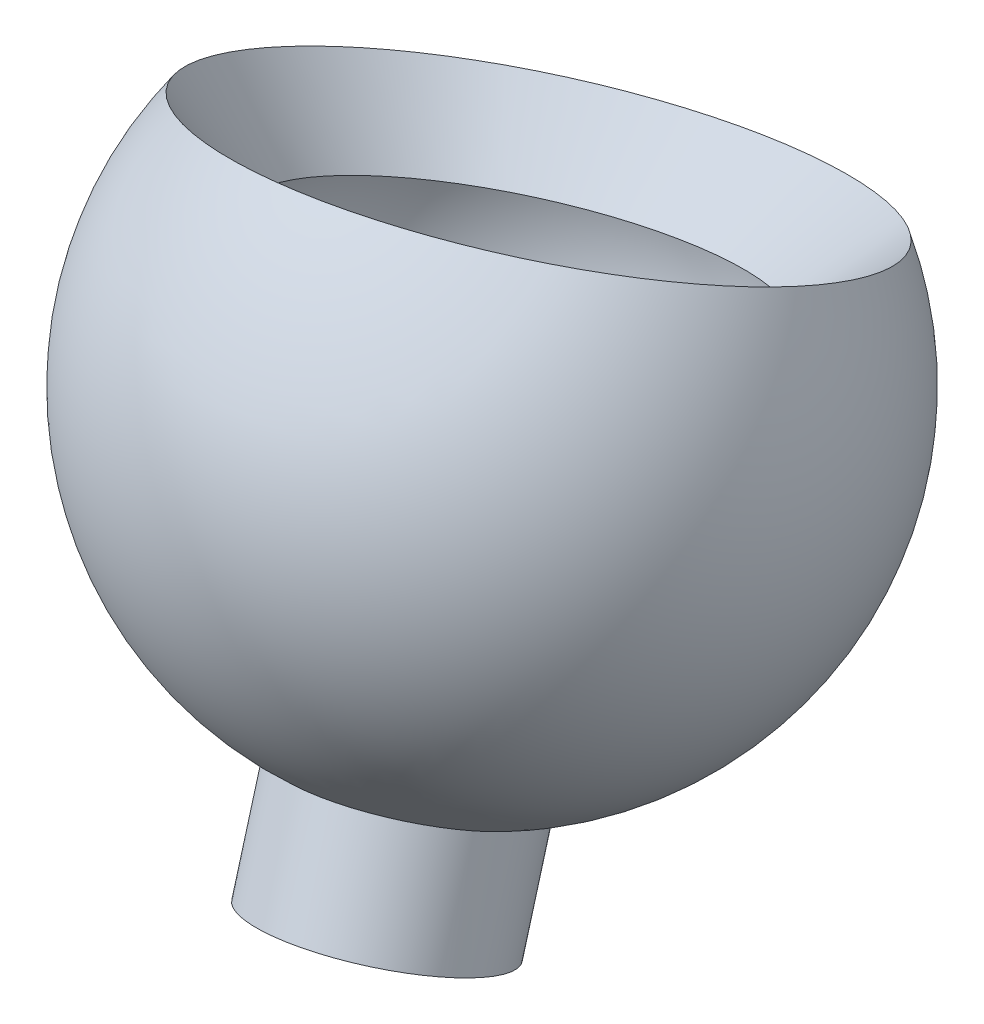
ISO-10303-21;
HEADER;
FILE_DESCRIPTION(('STEP AP214'),'2;1');
FILE_NAME('part.step','',(''),(''),'','','');
FILE_SCHEMA(('AUTOMOTIVE_DESIGN { 1 0 10303 214 1 1 1 1 }'));
ENDSEC;
DATA;
#1=APPLICATION_CONTEXT('core data for automotive mechanical design processes');
#2=APPLICATION_PROTOCOL_DEFINITION('international standard','automotive_design',2000,#1);
#3=PRODUCT_CONTEXT('',#1,'mechanical');
#4=PRODUCT('Part','Part','',(#3));
#5=PRODUCT_RELATED_PRODUCT_CATEGORY('part','',(#4));
#6=PRODUCT_DEFINITION_FORMATION('','',#4);
#7=PRODUCT_DEFINITION_CONTEXT('part definition',#1,'design');
#8=PRODUCT_DEFINITION('design','',#6,#7);
#9=PRODUCT_DEFINITION_SHAPE('','',#8);
#10=(LENGTH_UNIT() NAMED_UNIT(*) SI_UNIT(.MILLI.,.METRE.));
#11=(NAMED_UNIT(*) PLANE_ANGLE_UNIT() SI_UNIT($,.RADIAN.));
#12=(NAMED_UNIT(*) SI_UNIT($,.STERADIAN.) SOLID_ANGLE_UNIT());
#13=UNCERTAINTY_MEASURE_WITH_UNIT(LENGTH_MEASURE(1.E-05),#10,'distance_accuracy_value','');
#14=(GEOMETRIC_REPRESENTATION_CONTEXT(3) GLOBAL_UNCERTAINTY_ASSIGNED_CONTEXT((#13)) GLOBAL_UNIT_ASSIGNED_CONTEXT((#10,
#11,#12)) REPRESENTATION_CONTEXT('',''));
#15=CARTESIAN_POINT('',(0.,0.,0.));
#16=DIRECTION('',(0.,0.,1.));
#17=DIRECTION('',(1.,0.,0.));
#18=AXIS2_PLACEMENT_3D('',#15,#16,#17);
#19=CARTESIAN_POINT('',(-23.3826859021799,90.,-19.));
#20=DIRECTION('',(-0.103809544750828,0.916038966713815,-0.387422495320693));
#21=DIRECTION('',(0.994597194053264,0.0956101512020633,-0.0404366240986165));
#22=AXIS2_PLACEMENT_3D('',#19,#20,#21);
#23=SPHERICAL_SURFACE('',#22,4.49999999999999);
#24=CARTESIAN_POINT('',(-23.6258420320829,92.1456648376717,-19.9074710309702));
#25=DIRECTION('',(0.103809544750828,-0.916038966713815,0.387422495320693));
#26=DIRECTION('',(0.,-0.389527034298012,-0.921015032206855));
#27=AXIS2_PLACEMENT_3D('',#24,#25,#26);
#28=CIRCLE('',#27,3.84232921921324);
#29=CARTESIAN_POINT('',(-19.8042721720246,92.5130305152887,-20.0628418532706));
#30=VERTEX_POINT('',#29);
#31=EDGE_CURVE('E10',#30,#30,#28,.T.);
#32=CARTESIAN_POINT('',(-22.9422593039087,86.1135758088333,-17.3563055582472));
#33=DIRECTION('',(0.103809544750828,-0.916038966713815,0.387422495320693));
#34=DIRECTION('',(0.,-0.389527034298012,-0.921015032206855));
#35=AXIS2_PLACEMENT_3D('',#32,#33,#34);
#36=CIRCLE('',#35,1.5);
#37=CARTESIAN_POINT('',(-21.4503635128288,86.2569910356363,-17.4169604943951));
#38=VERTEX_POINT('',#37);
#39=EDGE_CURVE('E61',#38,#38,#36,.T.);
#40=CARTESIAN_POINT('',(-19.8042721720246,92.5130305152887,-20.0628418532706));
#41=CARTESIAN_POINT('',(-19.7537232932553,92.4519770899122,-20.0370203857711));
#42=CARTESIAN_POINT('',(-19.7050206426366,92.3896273909668,-20.0106506822698));
#43=CARTESIAN_POINT('',(-19.6114488480763,92.2625338025971,-19.9568986947074));
#44=CARTESIAN_POINT('',(-19.5665797041347,92.1977899131727,-19.9295164106463));
#45=CARTESIAN_POINT('',(-19.4808159733046,92.0661063005033,-19.8738231534084));
#46=CARTESIAN_POINT('',(-19.4399213864161,91.9991665772584,-19.8455121802315));
#47=CARTESIAN_POINT('',(-19.3622323754743,91.8632984149138,-19.7880491416459));
#48=CARTESIAN_POINT('',(-19.325437951421,91.7943699758141,-19.7588970762372));
#49=CARTESIAN_POINT('',(-19.2560630611508,91.6547371097825,-19.6998418227464));
#50=CARTESIAN_POINT('',(-19.2234825949338,91.5840326828506,-19.6699386346643));
#51=CARTESIAN_POINT('',(-19.1626361755734,91.4410661953721,-19.6094734848848));
#52=CARTESIAN_POINT('',(-19.13437022243,91.3688041348256,-19.5789115231875));
#53=CARTESIAN_POINT('',(-19.082240122934,91.2229455059544,-19.5172231933078));
#54=CARTESIAN_POINT('',(-19.0583759765814,91.1493489376299,-19.4860968251254));
#55=CARTESIAN_POINT('',(-19.0151231759465,91.001048550001,-19.423375796523));
#56=CARTESIAN_POINT('',(-18.9957345216642,90.9263447306968,-19.391781136103));
#57=CARTESIAN_POINT('',(-18.9614925752142,90.7760605141878,-19.3282210821283));
#58=CARTESIAN_POINT('',(-18.9466392830464,90.700480116983,-19.2962556885737));
#59=CARTESIAN_POINT('',(-18.9215139252098,90.5486761252203,-19.2320528725086));
#60=CARTESIAN_POINT('',(-18.911241859541,90.4724525306623,-19.1998154499982));
#61=CARTESIAN_POINT('',(-18.895310673294,90.3195975106363,-19.1351681200999));
#62=CARTESIAN_POINT('',(-18.8896515527157,90.2429660851682,-19.1027582127121));
#63=CARTESIAN_POINT('',(-18.882963731107,90.0895320291355,-19.037865989766));
#64=CARTESIAN_POINT('',(-18.8819350300766,90.0127293985709,-19.0053836742076));
#65=CARTESIAN_POINT('',(-18.8845112240357,89.859190086799,-18.9404469352064));
#66=CARTESIAN_POINT('',(-18.8881161190252,89.7824534055918,-18.9079925117634));
#67=CARTESIAN_POINT('',(-18.8999483736733,89.6292829433511,-18.8432117711541));
#68=CARTESIAN_POINT('',(-18.908175733332,89.5528491623176,-18.8108854539877));
#69=CARTESIAN_POINT('',(-18.9292275125248,89.4005205159317,-18.74646074452));
#70=CARTESIAN_POINT('',(-18.942051932059,89.3246256505793,-18.7143623522187));
#71=CARTESIAN_POINT('',(-18.9722582312101,89.1736091869761,-18.6504926072737));
#72=CARTESIAN_POINT('',(-18.9896401108269,89.0984875887253,-18.6187212546301));
#73=CARTESIAN_POINT('',(-19.02890765763,88.9492496230186,-18.5556036939459));
#74=CARTESIAN_POINT('',(-19.0507933248162,88.8751332555627,-18.5242574859053));
#75=CARTESIAN_POINT('',(-19.099000867256,88.728134611144,-18.4620870065929));
#76=CARTESIAN_POINT('',(-19.1253227425096,88.6552523341813,-18.431262735321));
#77=CARTESIAN_POINT('',(-19.1823214232689,88.51094691977,-18.3702313100531));
#78=CARTESIAN_POINT('',(-19.2129982287746,88.4395237823215,-18.340024156057));
#79=CARTESIAN_POINT('',(-19.278612044882,88.2983571903656,-18.2803202402862));
#80=CARTESIAN_POINT('',(-19.3135490554838,88.2286137358583,-18.2508234785115));
#81=CARTESIAN_POINT('',(-19.3875754017842,88.0910218666162,-18.1926314285501));
#82=CARTESIAN_POINT('',(-19.4266647374829,88.0231734518816,-18.1639361403635));
#83=CARTESIAN_POINT('',(-19.508875032247,87.8895811674254,-18.1074356441179));
#84=CARTESIAN_POINT('',(-19.5519959913124,87.8238372977039,-18.079630436059));
#85=CARTESIAN_POINT('',(-19.6421363820734,87.6946571100324,-18.0249959581904));
#86=CARTESIAN_POINT('',(-19.689155813769,87.6312207920824,-17.9981666883807));
#87=CARTESIAN_POINT('',(-19.7869479611339,87.5068515892722,-17.9455669315531));
#88=CARTESIAN_POINT('',(-19.8377206768032,87.4459187044121,-17.9197964445352));
#89=CARTESIAN_POINT('',(-19.9428626140898,87.3267445191996,-17.8693938286088));
#90=CARTESIAN_POINT('',(-19.9972318357072,87.2685032188472,-17.8447616997004));
#91=CARTESIAN_POINT('',(-20.1093989007398,87.154892041731,-17.7967118597546));
#92=CARTESIAN_POINT('',(-20.167196744155,87.0995221649672,-17.7732941487173));
#93=CARTESIAN_POINT('',(-20.2860425841226,86.9918248118839,-17.7277454561539));
#94=CARTESIAN_POINT('',(-20.3470905806749,86.9394973355644,-17.7056144746278));
#95=CARTESIAN_POINT('',(-20.4722482128333,86.8380463497988,-17.6627075727533));
#96=CARTESIAN_POINT('',(-20.5363578484392,86.7889228403527,-17.6419316524048));
#97=CARTESIAN_POINT('',(-20.6674408260681,86.6940315210249,-17.6017990455463));
#98=CARTESIAN_POINT('',(-20.7344141680909,86.6482637111432,-17.5824423590362));
#99=CARTESIAN_POINT('',(-20.8710176514732,86.5602249393013,-17.5452079160579));
#100=CARTESIAN_POINT('',(-20.9406477928326,86.517953977341,-17.5273301595897));
#101=CARTESIAN_POINT('',(-21.0823502557939,86.4370400822175,-17.4931090573288));
#102=CARTESIAN_POINT('',(-21.1544225773958,86.3983971490542,-17.4767657115361));
#103=CARTESIAN_POINT('',(-21.3007854053862,86.324856191136,-17.4456628627925));
#104=CARTESIAN_POINT('',(-21.3750759117748,86.2899581663812,-17.4309033598417));
#105=CARTESIAN_POINT('',(-21.4503635128288,86.2569910356363,-17.4169604943951));
#106=B_SPLINE_CURVE_WITH_KNOTS('',3,(#40,#41,#42,#43,#44,#45,#46,#47,#48,#49,#50,#51,#52,#53,
#54,#55,#56,#57,#58,#59,#60,#61,#62,#63,#64,#65,#66,#67,#68,#69,#70,#71,#72,#73,#74,#75,#76,#77,
#78,#79,#80,#81,#82,#83,#84,#85,#86,#87,#88,#89,#90,#91,#92,#93,#94,#95,#96,#97,#98,#99,#100,
#101,#102,#103,#104,#105),.UNSPECIFIED.,.F.,.F.,(4,2,2,2,2,2,2,2,2,2,2,2,2,2,2,2,2,2,2,2,2,2,2,
2,2,2,2,2,2,2,2,2,4),(0.,0.250057630485919,0.500115260971834,0.750172891457757,1.00023052194367,
1.25028815242958,1.5003457829155,1.75040341340141,2.00046104388733,2.25051867437325,
2.50057630485917,2.75063393534508,3.000691565831,3.25074919631691,3.50080682680283,
3.75086445728875,4.00092208777466,4.25097971826057,4.50103734874649,4.75109497923241,
5.00115260971833,5.25121024020424,5.50126787069015,5.75132550117607,6.00138313166198,
6.2514407621479,6.50149839263382,6.75155602311973,7.00161365360565,7.25167128409157,
7.50172891457748,7.7517865450634,8.00184417554932),.UNSPECIFIED.);
#107=EDGE_CURVE('BSEAM39',#30,#38,#106,.T.);
#108=ORIENTED_EDGE('',*,*,#31,.T.);
#109=ORIENTED_EDGE('',*,*,#39,.F.);
#110=ORIENTED_EDGE('',*,*,#107,.T.);
#111=ORIENTED_EDGE('',*,*,#107,.F.);
#112=EDGE_LOOP('',(#108,#110,#109,#111));
#113=FACE_BOUND('',#112,.T.);
#114=ADVANCED_FACE('F39',(#113),#23,.T.);
#115=CARTESIAN_POINT('',(-23.6258420320829,92.1456648376717,-19.9074710309702));
#116=DIRECTION('',(-0.103809544750828,0.916038966713815,-0.387422495320693));
#117=DIRECTION('',(0.,-0.389527034298012,-0.921015032206855));
#118=AXIS2_PLACEMENT_3D('',#115,#116,#117);
#119=CONICAL_SURFACE('',#118,3.84232921921324,0.785398163397463);
#120=CARTESIAN_POINT('',(-23.5186486878665,91.1997664570333,-19.5074200241212));
#121=DIRECTION('',(0.103809544750828,-0.916038966713815,0.387422495320693));
#122=DIRECTION('',(0.,-0.389527034298012,-0.921015032206855));
#123=AXIS2_PLACEMENT_3D('',#120,#121,#122);
#124=CIRCLE('',#123,2.80973299240458);
#125=CARTESIAN_POINT('',(-23.5186486878665,90.1052994973327,-22.0952263466134));
#126=VERTEX_POINT('',#125);
#127=EDGE_CURVE('E44',#126,#126,#124,.T.);
#128=ORIENTED_EDGE('',*,*,#127,.T.);
#129=EDGE_LOOP('',(#128));
#130=FACE_BOUND('',#129,.T.);
#131=ORIENTED_EDGE('',*,*,#31,.F.);
#132=EDGE_LOOP('',(#131));
#133=FACE_BOUND('',#132,.T.);
#134=ADVANCED_FACE('F69',(#130,#133),#119,.F.);
#135=CARTESIAN_POINT('',(-23.3826859021799,90.,-19.));
#136=DIRECTION('',(-0.103809544750828,0.916038966713815,-0.387422495320693));
#137=DIRECTION('',(0.994597194053264,0.0956101512020633,-0.0404366240986165));
#138=AXIS2_PLACEMENT_3D('',#135,#136,#137);
#139=SPHERICAL_SURFACE('',#138,3.1);
#140=ORIENTED_EDGE('',*,*,#127,.F.);
#141=EDGE_LOOP('',(#140));
#142=FACE_BOUND('',#141,.T.);
#143=ADVANCED_FACE('F71',(#142),#139,.F.);
#144=CARTESIAN_POINT('',(-22.2837855544871,86.9571751265746,-17.7130909839836));
#145=DIRECTION('',(-0.103809544750828,0.916038966713815,-0.387422495320693));
#146=DIRECTION('',(0.,-0.389527034298012,-0.921015032206855));
#147=AXIS2_PLACEMENT_3D('',#144,#145,#146);
#148=PLANE('',#147);
#149=CARTESIAN_POINT('',(-23.029733450027,86.885467513173,-17.6827635159096));
#150=DIRECTION('',(0.103809544750828,-0.916038966713815,0.387422495320693));
#151=DIRECTION('',(0.,-0.389527034298012,-0.921015032206855));
#152=AXIS2_PLACEMENT_3D('',#149,#150,#151);
#153=CIRCLE('',#152,0.750000000000001);
#154=CARTESIAN_POINT('',(-23.029733450027,86.5933222374495,-18.3735247900648));
#155=VERTEX_POINT('',#154);
#156=EDGE_CURVE('E47',#155,#155,#153,.T.);
#157=ORIENTED_EDGE('',*,*,#156,.T.);
#158=EDGE_LOOP('',(#157));
#159=FACE_BOUND('',#158,.T.);
#160=ADVANCED_FACE('F80',(#159),#148,.F.);
#161=CARTESIAN_POINT('',(-24.4207813496881,99.1603896671381,-22.8742249532069));
#162=DIRECTION('',(-0.103809544750828,0.916038966713815,-0.387422495320693));
#163=DIRECTION('',(0.,-0.389527034298012,-0.921015032206855));
#164=AXIS2_PLACEMENT_3D('',#161,#162,#163);
#165=CYLINDRICAL_SURFACE('',#164,0.750000000000001);
#166=CARTESIAN_POINT('',(-22.780590542625,84.6869739930599,-16.75294952714));
#167=DIRECTION('',(0.103809544750828,-0.916038966713815,0.387422495320693));
#168=DIRECTION('',(0.,-0.389527034298012,-0.921015032206855));
#169=AXIS2_PLACEMENT_3D('',#166,#167,#168);
#170=CIRCLE('',#169,0.750000000000003);
#171=CARTESIAN_POINT('',(-22.780590542625,84.3948287173364,-17.4437108012951));
#172=VERTEX_POINT('',#171);
#173=EDGE_CURVE('E52',#172,#172,#170,.T.);
#174=CARTESIAN_POINT('',(-22.780590542625,84.3948287173364,-17.4437108012951));
#175=CARTESIAN_POINT('',(-22.7831857812438,84.4177296915042,-17.4533963636781));
#176=CARTESIAN_POINT('',(-22.7857810198626,84.4406306656721,-17.4630819260612));
#177=CARTESIAN_POINT('',(-22.7909714971001,84.4864326140078,-17.4824530508272));
#178=CARTESIAN_POINT('',(-22.7935667357189,84.5093335881756,-17.4921386132102));
#179=CARTESIAN_POINT('',(-22.7987572129564,84.5551355365113,-17.5115097379762));
#180=CARTESIAN_POINT('',(-22.8013524515752,84.5780365106791,-17.5211953003593));
#181=CARTESIAN_POINT('',(-22.8065429288128,84.6238384590148,-17.5405664251253));
#182=CARTESIAN_POINT('',(-22.8091381674315,84.6467394331827,-17.5502519875083));
#183=CARTESIAN_POINT('',(-22.8143286446691,84.6925413815184,-17.5696231122743));
#184=CARTESIAN_POINT('',(-22.8169238832878,84.7154423556862,-17.5793086746574));
#185=CARTESIAN_POINT('',(-22.8221143605254,84.7612443040219,-17.5986797994234));
#186=CARTESIAN_POINT('',(-22.8247095991441,84.7841452781897,-17.6083653618064));
#187=CARTESIAN_POINT('',(-22.8299000763817,84.8299472265254,-17.6277364865725));
#188=CARTESIAN_POINT('',(-22.8324953150005,84.8528482006933,-17.6374220489555));
#189=CARTESIAN_POINT('',(-22.837685792238,84.898650149029,-17.6567931737215));
#190=CARTESIAN_POINT('',(-22.8402810308568,84.9215511231968,-17.6664787361045));
#191=CARTESIAN_POINT('',(-22.8454715080943,84.9673530715325,-17.6858498608706));
#192=CARTESIAN_POINT('',(-22.8480667467131,84.9902540457004,-17.6955354232536));
#193=CARTESIAN_POINT('',(-22.8532572239506,85.036055994036,-17.7149065480196));
#194=CARTESIAN_POINT('',(-22.8558524625694,85.0589569682039,-17.7245921104026));
#195=CARTESIAN_POINT('',(-22.8610429398069,85.1047589165396,-17.7439632351687));
#196=CARTESIAN_POINT('',(-22.8636381784257,85.1276598907074,-17.7536487975517));
#197=CARTESIAN_POINT('',(-22.8688286556633,85.1734618390431,-17.7730199223177));
#198=CARTESIAN_POINT('',(-22.871423894282,85.196362813211,-17.7827054847007));
#199=CARTESIAN_POINT('',(-22.8766143715196,85.2421647615466,-17.8020766094668));
#200=CARTESIAN_POINT('',(-22.8792096101383,85.2650657357145,-17.8117621718498));
#201=CARTESIAN_POINT('',(-22.8844000873759,85.3108676840502,-17.8311332966158));
#202=CARTESIAN_POINT('',(-22.8869953259946,85.333768658218,-17.8408188589988));
#203=CARTESIAN_POINT('',(-22.8921858032322,85.3795706065537,-17.8601899837649));
#204=CARTESIAN_POINT('',(-22.894781041851,85.4024715807216,-17.8698755461479));
#205=CARTESIAN_POINT('',(-22.8999715190885,85.4482735290572,-17.8892466709139));
#206=CARTESIAN_POINT('',(-22.9025667577073,85.4711745032251,-17.8989322332969));
#207=CARTESIAN_POINT('',(-22.9077572349448,85.5169764515608,-17.918303358063));
#208=CARTESIAN_POINT('',(-22.9103524735636,85.5398774257286,-17.927988920446));
#209=CARTESIAN_POINT('',(-22.9155429508011,85.5856793740643,-17.947360045212));
#210=CARTESIAN_POINT('',(-22.9181381894199,85.6085803482322,-17.957045607595));
#211=CARTESIAN_POINT('',(-22.9233286666574,85.6543822965679,-17.9764167323611));
#212=CARTESIAN_POINT('',(-22.9259239052762,85.6772832707357,-17.9861022947441));
#213=CARTESIAN_POINT('',(-22.9311143825137,85.7230852190714,-18.0054734195101));
#214=CARTESIAN_POINT('',(-22.9337096211325,85.7459861932392,-18.0151589818931));
#215=CARTESIAN_POINT('',(-22.9389000983701,85.7917881415749,-18.0345301066592));
#216=CARTESIAN_POINT('',(-22.9414953369888,85.8146891157428,-18.0442156690422));
#217=CARTESIAN_POINT('',(-22.9466858142264,85.8604910640785,-18.0635867938082));
#218=CARTESIAN_POINT('',(-22.9492810528451,85.8833920382463,-18.0732723561912));
#219=CARTESIAN_POINT('',(-22.9544715300827,85.929193986582,-18.0926434809573));
#220=CARTESIAN_POINT('',(-22.9570667687015,85.9520949607498,-18.1023290433403));
#221=CARTESIAN_POINT('',(-22.962257245939,85.9978969090855,-18.1217001681063));
#222=CARTESIAN_POINT('',(-22.9648524845578,86.0207978832534,-18.1313857304893));
#223=CARTESIAN_POINT('',(-22.9700429617953,86.0665998315891,-18.1507568552554));
#224=CARTESIAN_POINT('',(-22.9726382004141,86.0895008057569,-18.1604424176384));
#225=CARTESIAN_POINT('',(-22.9778286776516,86.1353027540926,-18.1798135424044));
#226=CARTESIAN_POINT('',(-22.9804239162704,86.1582037282605,-18.1894991047875));
#227=CARTESIAN_POINT('',(-22.9856143935079,86.2040056765961,-18.2088702295535));
#228=CARTESIAN_POINT('',(-22.9882096321267,86.226906650764,-18.2185557919365));
#229=CARTESIAN_POINT('',(-22.9934001093642,86.2727085990997,-18.2379269167025));
#230=CARTESIAN_POINT('',(-22.995995347983,86.2956095732675,-18.2476124790856));
#231=CARTESIAN_POINT('',(-23.0011858252206,86.3414115216032,-18.2669836038516));
#232=CARTESIAN_POINT('',(-23.0037810638393,86.3643124957711,-18.2766691662346));
#233=CARTESIAN_POINT('',(-23.0089715410769,86.4101144441068,-18.2960402910006));
#234=CARTESIAN_POINT('',(-23.0115667796956,86.4330154182746,-18.3057258533837));
#235=CARTESIAN_POINT('',(-23.0167572569332,86.4788173666103,-18.3250969781497));
#236=CARTESIAN_POINT('',(-23.0193524955519,86.5017183407781,-18.3347825405327));
#237=CARTESIAN_POINT('',(-23.0245429727895,86.5475202891138,-18.3541536652987));
#238=CARTESIAN_POINT('',(-23.0271382114083,86.5704212632817,-18.3638392276818));
#239=CARTESIAN_POINT('',(-23.029733450027,86.5933222374495,-18.3735247900648));
#240=B_SPLINE_CURVE_WITH_KNOTS('',3,(#174,#175,#176,#177,#178,#179,#180,#181,#182,#183,#184,
#185,#186,#187,#188,#189,#190,#191,#192,#193,#194,#195,#196,#197,#198,#199,#200,#201,#202,#203,
#204,#205,#206,#207,#208,#209,#210,#211,#212,#213,#214,#215,#216,#217,#218,#219,#220,#221,#222,
#223,#224,#225,#226,#227,#228,#229,#230,#231,#232,#233,#234,#235,#236,#237,#238,#239),
.UNSPECIFIED.,.F.,.F.,(4,2,2,2,2,2,2,2,2,2,2,2,2,2,2,2,2,2,2,2,2,2,2,2,2,2,2,2,2,2,2,2,4),(0.,
0.0750000000000125,0.149999999999998,0.225000000000011,0.299999999999998,0.37500000000001,
0.449999999999998,0.52500000000001,0.599999999999996,0.675000000000008,0.749999999999995,
0.825000000000008,0.899999999999994,0.975000000000006,1.04999999999999,1.12500000000001,
1.19999999999999,1.27500000000001,1.34999999999999,1.425,1.49999999999999,1.575,
1.64999999999999,1.725,1.79999999999999,1.875,1.94999999999999,2.025,2.09999999999999,2.175,
2.24999999999999,2.325,2.39999999999999),.UNSPECIFIED.);
#241=EDGE_CURVE('BSEAM84',#172,#155,#240,.T.);
#242=ORIENTED_EDGE('',*,*,#173,.T.);
#243=ORIENTED_EDGE('',*,*,#156,.F.);
#244=ORIENTED_EDGE('',*,*,#241,.T.);
#245=ORIENTED_EDGE('',*,*,#241,.F.);
#246=EDGE_LOOP('',(#242,#244,#243,#245));
#247=FACE_BOUND('',#246,.T.);
#248=ADVANCED_FACE('F84',(#247),#165,.F.);
#249=CARTESIAN_POINT('',(-21.2886947515452,84.830389219863,-16.8136044632879));
#250=DIRECTION('',(-0.103809544750828,0.916038966713815,-0.387422495320693));
#251=DIRECTION('',(0.,-0.389527034298012,-0.921015032206855));
#252=AXIS2_PLACEMENT_3D('',#249,#250,#251);
#253=PLANE('',#252);
#254=CARTESIAN_POINT('',(-22.780590542625,84.6869739930599,-16.75294952714));
#255=DIRECTION('',(0.103809544750828,-0.916038966713815,0.387422495320693));
#256=DIRECTION('',(0.,-0.389527034298012,-0.921015032206855));
#257=AXIS2_PLACEMENT_3D('',#254,#255,#256);
#258=CIRCLE('',#257,1.5);
#259=CARTESIAN_POINT('',(-22.780590542625,84.1026834416129,-18.1344720754503));
#260=VERTEX_POINT('',#259);
#261=EDGE_CURVE('E59',#260,#260,#258,.T.);
#262=ORIENTED_EDGE('',*,*,#261,.T.);
#263=EDGE_LOOP('',(#262));
#264=FACE_BOUND('',#263,.T.);
#265=ORIENTED_EDGE('',*,*,#173,.F.);
#266=EDGE_LOOP('',(#265));
#267=FACE_BOUND('',#266,.T.);
#268=ADVANCED_FACE('F86',(#264,#267),#253,.F.);
#269=CARTESIAN_POINT('',(-24.4207813496881,99.1603896671381,-22.8742249532069));
#270=DIRECTION('',(-0.103809544750828,0.916038966713815,-0.387422495320693));
#271=DIRECTION('',(0.,-0.389527034298012,-0.921015032206855));
#272=AXIS2_PLACEMENT_3D('',#269,#270,#271);
#273=CYLINDRICAL_SURFACE('',#272,1.5);
#274=ORIENTED_EDGE('',*,*,#39,.T.);
#275=EDGE_LOOP('',(#274));
#276=FACE_BOUND('',#275,.T.);
#277=ORIENTED_EDGE('',*,*,#261,.F.);
#278=EDGE_LOOP('',(#277));
#279=FACE_BOUND('',#278,.T.);
#280=ADVANCED_FACE('F64',(#276,#279),#273,.T.);
#281=CLOSED_SHELL('',(#114,#134,#143,#160,#248,#268,#280));
#282=MANIFOLD_SOLID_BREP('B2',#281);
#283=ADVANCED_BREP_SHAPE_REPRESENTATION('',(#18,#282),#14);
#284=SHAPE_DEFINITION_REPRESENTATION(#9,#283);
ENDSEC;
END-ISO-10303-21;
